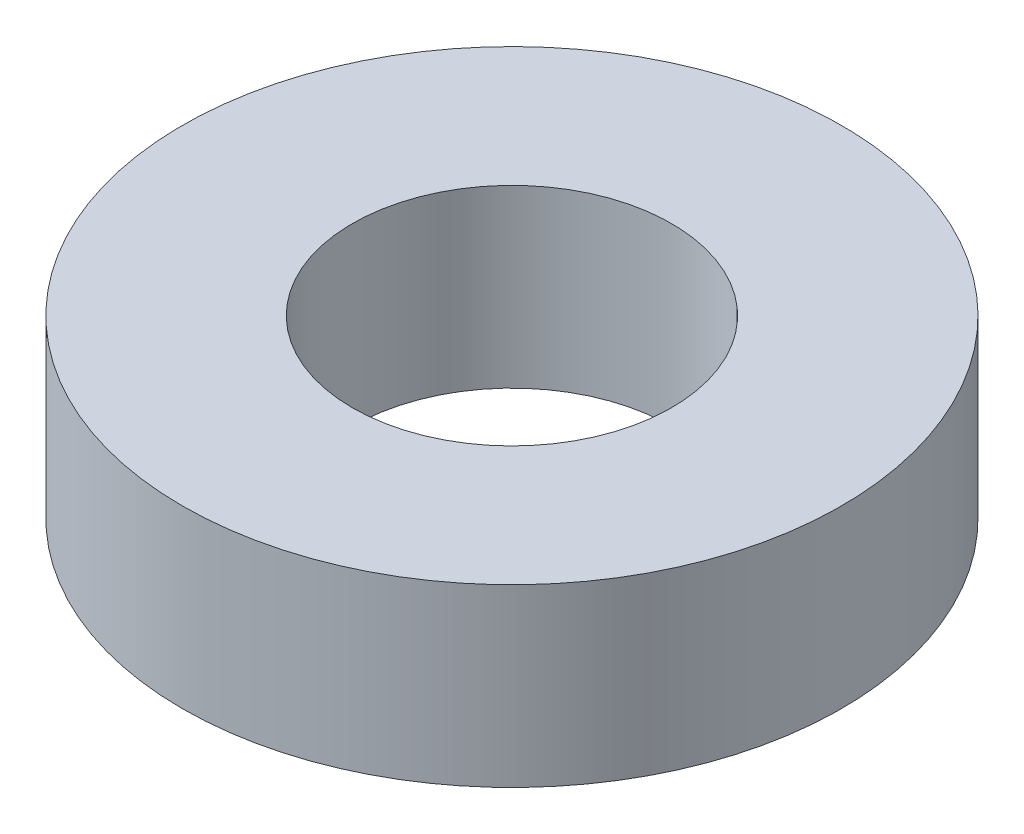
ISO-10303-21;
HEADER;
FILE_DESCRIPTION(('STEP AP214'),'2;1');
FILE_NAME('part.step','',(''),(''),'','','');
FILE_SCHEMA(('AUTOMOTIVE_DESIGN { 1 0 10303 214 1 1 1 1 }'));
ENDSEC;
DATA;
#1=APPLICATION_CONTEXT('core data for automotive mechanical design processes');
#2=APPLICATION_PROTOCOL_DEFINITION('international standard','automotive_design',2000,#1);
#3=PRODUCT_CONTEXT('',#1,'mechanical');
#4=PRODUCT('Part','Part','',(#3));
#5=PRODUCT_RELATED_PRODUCT_CATEGORY('part','',(#4));
#6=PRODUCT_DEFINITION_FORMATION('','',#4);
#7=PRODUCT_DEFINITION_CONTEXT('part definition',#1,'design');
#8=PRODUCT_DEFINITION('design','',#6,#7);
#9=PRODUCT_DEFINITION_SHAPE('','',#8);
#10=(LENGTH_UNIT() NAMED_UNIT(*) SI_UNIT(.MILLI.,.METRE.));
#11=(NAMED_UNIT(*) PLANE_ANGLE_UNIT() SI_UNIT($,.RADIAN.));
#12=(NAMED_UNIT(*) SI_UNIT($,.STERADIAN.) SOLID_ANGLE_UNIT());
#13=UNCERTAINTY_MEASURE_WITH_UNIT(LENGTH_MEASURE(1.E-05),#10,'distance_accuracy_value','');
#14=(GEOMETRIC_REPRESENTATION_CONTEXT(3) GLOBAL_UNCERTAINTY_ASSIGNED_CONTEXT((#13)) GLOBAL_UNIT_ASSIGNED_CONTEXT((#10,
#11,#12)) REPRESENTATION_CONTEXT('',''));
#15=CARTESIAN_POINT('',(0.,0.,0.));
#16=DIRECTION('',(0.,0.,1.));
#17=DIRECTION('',(1.,0.,0.));
#18=AXIS2_PLACEMENT_3D('',#15,#16,#17);
#19=CARTESIAN_POINT('',(0.,12.5,0.));
#20=DIRECTION('',(0.,1.,0.));
#21=DIRECTION('',(0.,0.,1.));
#22=AXIS2_PLACEMENT_3D('',#19,#20,#21);
#23=PLANE('',#22);
#24=CARTESIAN_POINT('',(0.,12.5,0.));
#25=DIRECTION('',(0.,1.,0.));
#26=DIRECTION('',(0.,0.,1.));
#27=AXIS2_PLACEMENT_3D('',#24,#25,#26);
#28=CIRCLE('',#27,23.46);
#29=CARTESIAN_POINT('',(0.,12.5,23.46));
#30=VERTEX_POINT('',#29);
#31=EDGE_CURVE('E10',#30,#30,#28,.T.);
#32=ORIENTED_EDGE('',*,*,#31,.T.);
#33=EDGE_LOOP('',(#32));
#34=FACE_BOUND('',#33,.T.);
#35=CARTESIAN_POINT('',(0.,12.5,0.));
#36=DIRECTION('',(0.,1.,0.));
#37=DIRECTION('',(0.,0.,1.));
#38=AXIS2_PLACEMENT_3D('',#35,#36,#37);
#39=CIRCLE('',#38,11.36);
#40=CARTESIAN_POINT('',(0.,12.5,11.36));
#41=VERTEX_POINT('',#40);
#42=EDGE_CURVE('E41',#41,#41,#39,.T.);
#43=ORIENTED_EDGE('',*,*,#42,.F.);
#44=EDGE_LOOP('',(#43));
#45=FACE_BOUND('',#44,.T.);
#46=ADVANCED_FACE('F30',(#34,#45),#23,.T.);
#47=CARTESIAN_POINT('',(0.,0.,0.));
#48=DIRECTION('',(0.,1.,0.));
#49=DIRECTION('',(0.,0.,1.));
#50=AXIS2_PLACEMENT_3D('',#47,#48,#49);
#51=PLANE('',#50);
#52=CARTESIAN_POINT('',(0.,0.,0.));
#53=DIRECTION('',(0.,1.,0.));
#54=DIRECTION('',(0.,0.,1.));
#55=AXIS2_PLACEMENT_3D('',#52,#53,#54);
#56=CIRCLE('',#55,23.46);
#57=CARTESIAN_POINT('',(0.,0.,23.46));
#58=VERTEX_POINT('',#57);
#59=EDGE_CURVE('E34',#58,#58,#56,.T.);
#60=ORIENTED_EDGE('',*,*,#59,.F.);
#61=EDGE_LOOP('',(#60));
#62=FACE_BOUND('',#61,.T.);
#63=CARTESIAN_POINT('',(0.,0.,0.));
#64=DIRECTION('',(0.,1.,0.));
#65=DIRECTION('',(0.,0.,1.));
#66=AXIS2_PLACEMENT_3D('',#63,#64,#65);
#67=CIRCLE('',#66,11.36);
#68=CARTESIAN_POINT('',(0.,0.,11.36));
#69=VERTEX_POINT('',#68);
#70=EDGE_CURVE('E43',#69,#69,#67,.T.);
#71=ORIENTED_EDGE('',*,*,#70,.T.);
#72=EDGE_LOOP('',(#71));
#73=FACE_BOUND('',#72,.T.);
#74=ADVANCED_FACE('F53',(#62,#73),#51,.F.);
#75=CARTESIAN_POINT('',(0.,12.5,0.));
#76=DIRECTION('',(0.,-1.,0.));
#77=DIRECTION('',(0.,0.,-1.));
#78=AXIS2_PLACEMENT_3D('',#75,#76,#77);
#79=CYLINDRICAL_SURFACE('',#78,23.46);
#80=ORIENTED_EDGE('',*,*,#31,.F.);
#81=EDGE_LOOP('',(#80));
#82=FACE_BOUND('',#81,.T.);
#83=ORIENTED_EDGE('',*,*,#59,.T.);
#84=EDGE_LOOP('',(#83));
#85=FACE_BOUND('',#84,.T.);
#86=ADVANCED_FACE('F32',(#82,#85),#79,.T.);
#87=CARTESIAN_POINT('',(0.,12.5,0.));
#88=DIRECTION('',(0.,-1.,0.));
#89=DIRECTION('',(0.,0.,-1.));
#90=AXIS2_PLACEMENT_3D('',#87,#88,#89);
#91=CYLINDRICAL_SURFACE('',#90,11.36);
#92=ORIENTED_EDGE('',*,*,#42,.T.);
#93=EDGE_LOOP('',(#92));
#94=FACE_BOUND('',#93,.T.);
#95=ORIENTED_EDGE('',*,*,#70,.F.);
#96=EDGE_LOOP('',(#95));
#97=FACE_BOUND('',#96,.T.);
#98=ADVANCED_FACE('F49',(#94,#97),#91,.F.);
#99=CLOSED_SHELL('',(#46,#74,#86,#98));
#100=MANIFOLD_SOLID_BREP('B2',#99);
#101=ADVANCED_BREP_SHAPE_REPRESENTATION('',(#18,#100),#14);
#102=SHAPE_DEFINITION_REPRESENTATION(#9,#101);
ENDSEC;
END-ISO-10303-21;
